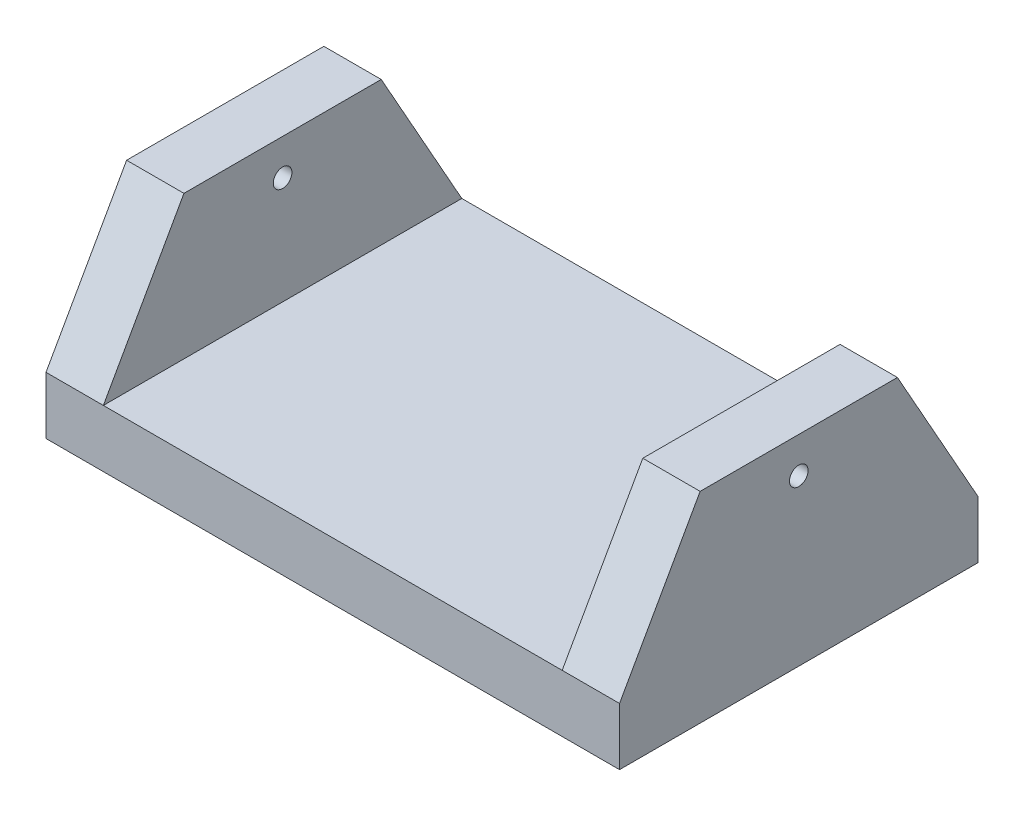
ISO-10303-21;
HEADER;
FILE_DESCRIPTION(('STEP AP214'),'2;1');
FILE_NAME('part.step','',(''),(''),'','','');
FILE_SCHEMA(('AUTOMOTIVE_DESIGN { 1 0 10303 214 1 1 1 1 }'));
ENDSEC;
DATA;
#1=APPLICATION_CONTEXT('core data for automotive mechanical design processes');
#2=APPLICATION_PROTOCOL_DEFINITION('international standard','automotive_design',2000,#1);
#3=PRODUCT_CONTEXT('',#1,'mechanical');
#4=PRODUCT('Part','Part','',(#3));
#5=PRODUCT_RELATED_PRODUCT_CATEGORY('part','',(#4));
#6=PRODUCT_DEFINITION_FORMATION('','',#4);
#7=PRODUCT_DEFINITION_CONTEXT('part definition',#1,'design');
#8=PRODUCT_DEFINITION('design','',#6,#7);
#9=PRODUCT_DEFINITION_SHAPE('','',#8);
#10=(LENGTH_UNIT() NAMED_UNIT(*) SI_UNIT(.MILLI.,.METRE.));
#11=(NAMED_UNIT(*) PLANE_ANGLE_UNIT() SI_UNIT($,.RADIAN.));
#12=(NAMED_UNIT(*) SI_UNIT($,.STERADIAN.) SOLID_ANGLE_UNIT());
#13=UNCERTAINTY_MEASURE_WITH_UNIT(LENGTH_MEASURE(1.E-05),#10,'distance_accuracy_value','');
#14=(GEOMETRIC_REPRESENTATION_CONTEXT(3) GLOBAL_UNCERTAINTY_ASSIGNED_CONTEXT((#13)) GLOBAL_UNIT_ASSIGNED_CONTEXT((#10,
#11,#12)) REPRESENTATION_CONTEXT('',''));
#15=CARTESIAN_POINT('',(0.,0.,0.));
#16=DIRECTION('',(0.,0.,1.));
#17=DIRECTION('',(1.,0.,0.));
#18=AXIS2_PLACEMENT_3D('',#15,#16,#17);
#19=CARTESIAN_POINT('',(0.,8.,0.));
#20=DIRECTION('',(0.,1.,0.));
#21=DIRECTION('',(0.,0.,1.));
#22=AXIS2_PLACEMENT_3D('',#19,#20,#21);
#23=PLANE('',#22);
#24=DIRECTION('',(-1.,0.,0.));
#25=VECTOR('',#24,1.);
#26=CARTESIAN_POINT('',(-40.,8.,-25.));
#27=LINE('',#26,#25);
#28=CARTESIAN_POINT('',(32.,8.,-25.));
#29=VERTEX_POINT('',#28);
#30=CARTESIAN_POINT('',(-32.,8.,-25.));
#31=VERTEX_POINT('',#30);
#32=EDGE_CURVE('E223',#29,#31,#27,.T.);
#33=ORIENTED_EDGE('',*,*,#32,.T.);
#34=DIRECTION('',(0.,0.,1.));
#35=VECTOR('',#34,1.);
#36=CARTESIAN_POINT('',(-32.,8.,0.));
#37=LINE('',#36,#35);
#38=CARTESIAN_POINT('',(-32.,8.,25.));
#39=VERTEX_POINT('',#38);
#40=EDGE_CURVE('E63',#31,#39,#37,.T.);
#41=ORIENTED_EDGE('',*,*,#40,.T.);
#42=DIRECTION('',(1.,0.,0.));
#43=VECTOR('',#42,1.);
#44=CARTESIAN_POINT('',(-40.,8.,25.));
#45=LINE('',#44,#43);
#46=CARTESIAN_POINT('',(32.,8.,25.));
#47=VERTEX_POINT('',#46);
#48=EDGE_CURVE('E222',#39,#47,#45,.T.);
#49=ORIENTED_EDGE('',*,*,#48,.T.);
#50=DIRECTION('',(0.,0.,1.));
#51=VECTOR('',#50,1.);
#52=CARTESIAN_POINT('',(32.,8.,0.));
#53=LINE('',#52,#51);
#54=EDGE_CURVE('E189',#29,#47,#53,.T.);
#55=ORIENTED_EDGE('',*,*,#54,.F.);
#56=EDGE_LOOP('',(#33,#41,#49,#55));
#57=FACE_BOUND('',#56,.T.);
#58=ADVANCED_FACE('F47',(#57),#23,.T.);
#59=CARTESIAN_POINT('',(40.,8.,-25.));
#60=DIRECTION('',(-1.,0.,0.));
#61=DIRECTION('',(0.,0.,1.));
#62=AXIS2_PLACEMENT_3D('',#59,#60,#61);
#63=PLANE('',#62);
#64=DIRECTION('',(0.,0.,-1.));
#65=VECTOR('',#64,1.);
#66=CARTESIAN_POINT('',(40.,0.,-25.));
#67=LINE('',#66,#65);
#68=CARTESIAN_POINT('',(40.,0.,25.));
#69=VERTEX_POINT('',#68);
#70=CARTESIAN_POINT('',(40.,0.,-25.));
#71=VERTEX_POINT('',#70);
#72=EDGE_CURVE('E210',#69,#71,#67,.T.);
#73=ORIENTED_EDGE('',*,*,#72,.T.);
#74=DIRECTION('',(0.,-1.,0.));
#75=VECTOR('',#74,1.);
#76=CARTESIAN_POINT('',(40.,8.,-25.));
#77=LINE('',#76,#75);
#78=CARTESIAN_POINT('',(40.,8.,-25.));
#79=VERTEX_POINT('',#78);
#80=EDGE_CURVE('E11',#79,#71,#77,.T.);
#81=ORIENTED_EDGE('',*,*,#80,.F.);
#82=DIRECTION('',(0.,-0.871729821083831,-0.489986855979986));
#83=VECTOR('',#82,1.);
#84=CARTESIAN_POINT('',(40.,12.5991008096868,-22.4149112585461));
#85=LINE('',#84,#83);
#86=CARTESIAN_POINT('',(40.,28.,-13.7582862458283));
#87=VERTEX_POINT('',#86);
#88=EDGE_CURVE('E197',#87,#79,#85,.T.);
#89=ORIENTED_EDGE('',*,*,#88,.F.);
#90=DIRECTION('',(0.,0.,-1.));
#91=VECTOR('',#90,1.);
#92=CARTESIAN_POINT('',(40.,28.,0.));
#93=LINE('',#92,#91);
#94=CARTESIAN_POINT('',(40.,28.,13.7582862458283));
#95=VERTEX_POINT('',#94);
#96=EDGE_CURVE('E201',#95,#87,#93,.T.);
#97=ORIENTED_EDGE('',*,*,#96,.F.);
#98=DIRECTION('',(0.,0.871729821083831,-0.489986855979986));
#99=VECTOR('',#98,1.);
#100=CARTESIAN_POINT('',(40.,12.5991008096868,22.4149112585461));
#101=LINE('',#100,#99);
#102=CARTESIAN_POINT('',(40.,8.,25.));
#103=VERTEX_POINT('',#102);
#104=EDGE_CURVE('E179',#103,#95,#101,.T.);
#105=ORIENTED_EDGE('',*,*,#104,.F.);
#106=DIRECTION('',(0.,-1.,0.));
#107=VECTOR('',#106,1.);
#108=CARTESIAN_POINT('',(40.,8.,25.));
#109=LINE('',#108,#107);
#110=EDGE_CURVE('E226',#103,#69,#109,.T.);
#111=ORIENTED_EDGE('',*,*,#110,.T.);
#112=EDGE_LOOP('',(#73,#81,#89,#97,#105,#111));
#113=FACE_BOUND('',#112,.T.);
#114=CARTESIAN_POINT('',(40.,23.,0.));
#115=DIRECTION('',(1.,0.,0.));
#116=DIRECTION('',(0.,0.,-1.));
#117=AXIS2_PLACEMENT_3D('',#114,#115,#116);
#118=CIRCLE('',#117,1.3);
#119=CARTESIAN_POINT('',(40.,23.,-1.3));
#120=VERTEX_POINT('',#119);
#121=EDGE_CURVE('E172',#120,#120,#118,.T.);
#122=ORIENTED_EDGE('',*,*,#121,.F.);
#123=EDGE_LOOP('',(#122));
#124=FACE_BOUND('',#123,.T.);
#125=ADVANCED_FACE('F49',(#113,#124),#63,.F.);
#126=CARTESIAN_POINT('',(-40.,8.,-25.));
#127=DIRECTION('',(0.,0.,1.));
#128=DIRECTION('',(1.,0.,0.));
#129=AXIS2_PLACEMENT_3D('',#126,#127,#128);
#130=PLANE('',#129);
#131=DIRECTION('',(-1.,0.,0.));
#132=VECTOR('',#131,1.);
#133=CARTESIAN_POINT('',(-40.,0.,-25.));
#134=LINE('',#133,#132);
#135=CARTESIAN_POINT('',(-40.,0.,-25.));
#136=VERTEX_POINT('',#135);
#137=EDGE_CURVE('E230',#71,#136,#134,.T.);
#138=ORIENTED_EDGE('',*,*,#137,.T.);
#139=DIRECTION('',(0.,-1.,0.));
#140=VECTOR('',#139,1.);
#141=CARTESIAN_POINT('',(-40.,8.,-25.));
#142=LINE('',#141,#140);
#143=CARTESIAN_POINT('',(-40.,8.,-25.));
#144=VERTEX_POINT('',#143);
#145=EDGE_CURVE('E56',#144,#136,#142,.T.);
#146=ORIENTED_EDGE('',*,*,#145,.F.);
#147=DIRECTION('',(-1.,0.,0.));
#148=VECTOR('',#147,1.);
#149=CARTESIAN_POINT('',(-32.,8.,-25.));
#150=LINE('',#149,#148);
#151=EDGE_CURVE('E71',#31,#144,#150,.T.);
#152=ORIENTED_EDGE('',*,*,#151,.F.);
#153=ORIENTED_EDGE('',*,*,#32,.F.);
#154=EDGE_CURVE('E218',#79,#29,#27,.T.);
#155=ORIENTED_EDGE('',*,*,#154,.F.);
#156=ORIENTED_EDGE('',*,*,#80,.T.);
#157=EDGE_LOOP('',(#138,#146,#152,#153,#155,#156));
#158=FACE_BOUND('',#157,.T.);
#159=ADVANCED_FACE('F277',(#158),#130,.F.);
#160=CARTESIAN_POINT('',(-40.,8.,-25.));
#161=DIRECTION('',(1.,0.,0.));
#162=DIRECTION('',(0.,0.,-1.));
#163=AXIS2_PLACEMENT_3D('',#160,#161,#162);
#164=PLANE('',#163);
#165=DIRECTION('',(0.,0.,1.));
#166=VECTOR('',#165,1.);
#167=CARTESIAN_POINT('',(-40.,0.,-25.));
#168=LINE('',#167,#166);
#169=CARTESIAN_POINT('',(-40.,0.,25.));
#170=VERTEX_POINT('',#169);
#171=EDGE_CURVE('E233',#136,#170,#168,.T.);
#172=ORIENTED_EDGE('',*,*,#171,.T.);
#173=DIRECTION('',(0.,-1.,0.));
#174=VECTOR('',#173,1.);
#175=CARTESIAN_POINT('',(-40.,8.,25.));
#176=LINE('',#175,#174);
#177=CARTESIAN_POINT('',(-40.,8.,25.));
#178=VERTEX_POINT('',#177);
#179=EDGE_CURVE('E242',#178,#170,#176,.T.);
#180=ORIENTED_EDGE('',*,*,#179,.F.);
#181=DIRECTION('',(0.,0.871729821083831,-0.489986855979986));
#182=VECTOR('',#181,1.);
#183=CARTESIAN_POINT('',(-40.,12.5991008096868,22.4149112585461));
#184=LINE('',#183,#182);
#185=CARTESIAN_POINT('',(-40.,28.,13.7582862458283));
#186=VERTEX_POINT('',#185);
#187=EDGE_CURVE('E165',#178,#186,#184,.T.);
#188=ORIENTED_EDGE('',*,*,#187,.T.);
#189=DIRECTION('',(0.,0.,-1.));
#190=VECTOR('',#189,1.);
#191=CARTESIAN_POINT('',(-40.,28.,0.));
#192=LINE('',#191,#190);
#193=CARTESIAN_POINT('',(-40.,28.,-13.7582862458283));
#194=VERTEX_POINT('',#193);
#195=EDGE_CURVE('E132',#186,#194,#192,.T.);
#196=ORIENTED_EDGE('',*,*,#195,.T.);
#197=DIRECTION('',(0.,-0.871729821083831,-0.489986855979986));
#198=VECTOR('',#197,1.);
#199=CARTESIAN_POINT('',(-40.,12.5991008096868,-22.4149112585461));
#200=LINE('',#199,#198);
#201=EDGE_CURVE('E161',#194,#144,#200,.T.);
#202=ORIENTED_EDGE('',*,*,#201,.T.);
#203=ORIENTED_EDGE('',*,*,#145,.T.);
#204=EDGE_LOOP('',(#172,#180,#188,#196,#202,#203));
#205=FACE_BOUND('',#204,.T.);
#206=CARTESIAN_POINT('',(-40.,23.,0.));
#207=DIRECTION('',(1.,0.,0.));
#208=DIRECTION('',(0.,0.,-1.));
#209=AXIS2_PLACEMENT_3D('',#206,#207,#208);
#210=CIRCLE('',#209,1.3);
#211=CARTESIAN_POINT('',(-40.,23.,-1.3));
#212=VERTEX_POINT('',#211);
#213=EDGE_CURVE('E157',#212,#212,#210,.T.);
#214=ORIENTED_EDGE('',*,*,#213,.T.);
#215=EDGE_LOOP('',(#214));
#216=FACE_BOUND('',#215,.T.);
#217=ADVANCED_FACE('F249',(#205,#216),#164,.F.);
#218=CARTESIAN_POINT('',(-40.,8.,25.));
#219=DIRECTION('',(0.,0.,-1.));
#220=DIRECTION('',(-1.,0.,0.));
#221=AXIS2_PLACEMENT_3D('',#218,#219,#220);
#222=PLANE('',#221);
#223=DIRECTION('',(1.,0.,0.));
#224=VECTOR('',#223,1.);
#225=CARTESIAN_POINT('',(-40.,0.,25.));
#226=LINE('',#225,#224);
#227=EDGE_CURVE('E236',#170,#69,#226,.T.);
#228=ORIENTED_EDGE('',*,*,#227,.T.);
#229=ORIENTED_EDGE('',*,*,#110,.F.);
#230=DIRECTION('',(1.,0.,0.));
#231=VECTOR('',#230,1.);
#232=CARTESIAN_POINT('',(32.,8.,25.));
#233=LINE('',#232,#231);
#234=EDGE_CURVE('E206',#47,#103,#233,.T.);
#235=ORIENTED_EDGE('',*,*,#234,.F.);
#236=ORIENTED_EDGE('',*,*,#48,.F.);
#237=EDGE_CURVE('E143',#178,#39,#45,.T.);
#238=ORIENTED_EDGE('',*,*,#237,.F.);
#239=ORIENTED_EDGE('',*,*,#179,.T.);
#240=EDGE_LOOP('',(#228,#229,#235,#236,#238,#239));
#241=FACE_BOUND('',#240,.T.);
#242=ADVANCED_FACE('F258',(#241),#222,.F.);
#243=CARTESIAN_POINT('',(0.,0.,0.));
#244=DIRECTION('',(0.,1.,0.));
#245=DIRECTION('',(0.,0.,1.));
#246=AXIS2_PLACEMENT_3D('',#243,#244,#245);
#247=PLANE('',#246);
#248=ORIENTED_EDGE('',*,*,#72,.F.);
#249=ORIENTED_EDGE('',*,*,#227,.F.);
#250=ORIENTED_EDGE('',*,*,#171,.F.);
#251=ORIENTED_EDGE('',*,*,#137,.F.);
#252=EDGE_LOOP('',(#248,#249,#250,#251));
#253=FACE_BOUND('',#252,.T.);
#254=ADVANCED_FACE('F256',(#253),#247,.F.);
#255=CARTESIAN_POINT('',(32.,12.5991008096868,-22.4149112585461));
#256=DIRECTION('',(0.,-0.489986855979986,0.871729821083831));
#257=DIRECTION('',(0.,-0.871729821083831,-0.489986855979987));
#258=AXIS2_PLACEMENT_3D('',#255,#256,#257);
#259=PLANE('',#258);
#260=ORIENTED_EDGE('',*,*,#88,.T.);
#261=ORIENTED_EDGE('',*,*,#154,.T.);
#262=DIRECTION('',(0.,-0.871729821083831,-0.489986855979986));
#263=VECTOR('',#262,1.);
#264=CARTESIAN_POINT('',(32.,12.5991008096868,-22.4149112585461));
#265=LINE('',#264,#263);
#266=CARTESIAN_POINT('',(32.,28.,-13.7582862458283));
#267=VERTEX_POINT('',#266);
#268=EDGE_CURVE('E178',#267,#29,#265,.T.);
#269=ORIENTED_EDGE('',*,*,#268,.F.);
#270=DIRECTION('',(1.,0.,0.));
#271=VECTOR('',#270,1.);
#272=CARTESIAN_POINT('',(32.,28.,-13.7582862458283));
#273=LINE('',#272,#271);
#274=EDGE_CURVE('E193',#267,#87,#273,.T.);
#275=ORIENTED_EDGE('',*,*,#274,.T.);
#276=EDGE_LOOP('',(#260,#261,#269,#275));
#277=FACE_BOUND('',#276,.T.);
#278=ADVANCED_FACE('F281',(#277),#259,.F.);
#279=CARTESIAN_POINT('',(32.,12.5991008096868,22.4149112585461));
#280=DIRECTION('',(0.,-0.489986855979986,-0.871729821083831));
#281=DIRECTION('',(0.,0.871729821083831,-0.489986855979986));
#282=AXIS2_PLACEMENT_3D('',#279,#280,#281);
#283=PLANE('',#282);
#284=ORIENTED_EDGE('',*,*,#104,.T.);
#285=DIRECTION('',(1.,0.,0.));
#286=VECTOR('',#285,1.);
#287=CARTESIAN_POINT('',(32.,28.,13.7582862458283));
#288=LINE('',#287,#286);
#289=CARTESIAN_POINT('',(32.,28.,13.7582862458283));
#290=VERTEX_POINT('',#289);
#291=EDGE_CURVE('E211',#290,#95,#288,.T.);
#292=ORIENTED_EDGE('',*,*,#291,.F.);
#293=DIRECTION('',(0.,0.871729821083831,-0.489986855979986));
#294=VECTOR('',#293,1.);
#295=CARTESIAN_POINT('',(32.,12.5991008096868,22.4149112585461));
#296=LINE('',#295,#294);
#297=EDGE_CURVE('E186',#47,#290,#296,.T.);
#298=ORIENTED_EDGE('',*,*,#297,.F.);
#299=ORIENTED_EDGE('',*,*,#234,.T.);
#300=EDGE_LOOP('',(#284,#292,#298,#299));
#301=FACE_BOUND('',#300,.T.);
#302=ADVANCED_FACE('F268',(#301),#283,.F.);
#303=CARTESIAN_POINT('',(32.,23.,0.));
#304=DIRECTION('',(1.,0.,0.));
#305=DIRECTION('',(0.,0.,-1.));
#306=AXIS2_PLACEMENT_3D('',#303,#304,#305);
#307=CYLINDRICAL_SURFACE('',#306,1.3);
#308=CARTESIAN_POINT('',(32.,23.,0.));
#309=DIRECTION('',(1.,0.,0.));
#310=DIRECTION('',(0.,0.,-1.));
#311=AXIS2_PLACEMENT_3D('',#308,#309,#310);
#312=CIRCLE('',#311,1.3);
#313=CARTESIAN_POINT('',(32.,23.,-1.3));
#314=VERTEX_POINT('',#313);
#315=EDGE_CURVE('E174',#314,#314,#312,.T.);
#316=ORIENTED_EDGE('',*,*,#315,.F.);
#317=EDGE_LOOP('',(#316));
#318=FACE_BOUND('',#317,.T.);
#319=ORIENTED_EDGE('',*,*,#121,.T.);
#320=EDGE_LOOP('',(#319));
#321=FACE_BOUND('',#320,.T.);
#322=ADVANCED_FACE('F288',(#318,#321),#307,.F.);
#323=CARTESIAN_POINT('',(32.,28.,0.));
#324=DIRECTION('',(0.,-1.,0.));
#325=DIRECTION('',(0.,0.,-1.));
#326=AXIS2_PLACEMENT_3D('',#323,#324,#325);
#327=PLANE('',#326);
#328=ORIENTED_EDGE('',*,*,#96,.T.);
#329=ORIENTED_EDGE('',*,*,#274,.F.);
#330=DIRECTION('',(0.,0.,-1.));
#331=VECTOR('',#330,1.);
#332=CARTESIAN_POINT('',(32.,28.,0.));
#333=LINE('',#332,#331);
#334=EDGE_CURVE('E183',#290,#267,#333,.T.);
#335=ORIENTED_EDGE('',*,*,#334,.F.);
#336=ORIENTED_EDGE('',*,*,#291,.T.);
#337=EDGE_LOOP('',(#328,#329,#335,#336));
#338=FACE_BOUND('',#337,.T.);
#339=ADVANCED_FACE('F272',(#338),#327,.F.);
#340=CARTESIAN_POINT('',(32.,0.,0.));
#341=DIRECTION('',(1.,0.,0.));
#342=DIRECTION('',(0.,0.,-1.));
#343=AXIS2_PLACEMENT_3D('',#340,#341,#342);
#344=PLANE('',#343);
#345=ORIENTED_EDGE('',*,*,#315,.T.);
#346=EDGE_LOOP('',(#345));
#347=FACE_BOUND('',#346,.T.);
#348=ORIENTED_EDGE('',*,*,#268,.T.);
#349=ORIENTED_EDGE('',*,*,#54,.T.);
#350=ORIENTED_EDGE('',*,*,#297,.T.);
#351=ORIENTED_EDGE('',*,*,#334,.T.);
#352=EDGE_LOOP('',(#348,#349,#350,#351));
#353=FACE_BOUND('',#352,.T.);
#354=ADVANCED_FACE('F276',(#347,#353),#344,.F.);
#355=CARTESIAN_POINT('',(-32.,12.5991008096868,-22.4149112585461));
#356=DIRECTION('',(0.,0.489986855979986,-0.871729821083831));
#357=DIRECTION('',(0.,0.871729821083831,0.489986855979987));
#358=AXIS2_PLACEMENT_3D('',#355,#356,#357);
#359=PLANE('',#358);
#360=ORIENTED_EDGE('',*,*,#201,.F.);
#361=DIRECTION('',(-1.,0.,0.));
#362=VECTOR('',#361,1.);
#363=CARTESIAN_POINT('',(-32.,28.,-13.7582862458283));
#364=LINE('',#363,#362);
#365=CARTESIAN_POINT('',(-32.,28.,-13.7582862458283));
#366=VERTEX_POINT('',#365);
#367=EDGE_CURVE('E137',#366,#194,#364,.T.);
#368=ORIENTED_EDGE('',*,*,#367,.F.);
#369=DIRECTION('',(0.,-0.871729821083831,-0.489986855979986));
#370=VECTOR('',#369,1.);
#371=CARTESIAN_POINT('',(-32.,12.5991008096868,-22.4149112585461));
#372=LINE('',#371,#370);
#373=EDGE_CURVE('E150',#366,#31,#372,.T.);
#374=ORIENTED_EDGE('',*,*,#373,.T.);
#375=ORIENTED_EDGE('',*,*,#151,.T.);
#376=EDGE_LOOP('',(#360,#368,#374,#375));
#377=FACE_BOUND('',#376,.T.);
#378=ADVANCED_FACE('F324',(#377),#359,.T.);
#379=CARTESIAN_POINT('',(-32.,28.,0.));
#380=DIRECTION('',(0.,1.,0.));
#381=DIRECTION('',(0.,0.,1.));
#382=AXIS2_PLACEMENT_3D('',#379,#380,#381);
#383=PLANE('',#382);
#384=ORIENTED_EDGE('',*,*,#195,.F.);
#385=DIRECTION('',(-1.,0.,0.));
#386=VECTOR('',#385,1.);
#387=CARTESIAN_POINT('',(-32.,28.,13.7582862458283));
#388=LINE('',#387,#386);
#389=CARTESIAN_POINT('',(-32.,28.,13.7582862458283));
#390=VERTEX_POINT('',#389);
#391=EDGE_CURVE('E126',#390,#186,#388,.T.);
#392=ORIENTED_EDGE('',*,*,#391,.F.);
#393=DIRECTION('',(0.,0.,-1.));
#394=VECTOR('',#393,1.);
#395=CARTESIAN_POINT('',(-32.,28.,0.));
#396=LINE('',#395,#394);
#397=EDGE_CURVE('E130',#390,#366,#396,.T.);
#398=ORIENTED_EDGE('',*,*,#397,.T.);
#399=ORIENTED_EDGE('',*,*,#367,.T.);
#400=EDGE_LOOP('',(#384,#392,#398,#399));
#401=FACE_BOUND('',#400,.T.);
#402=ADVANCED_FACE('F128',(#401),#383,.T.);
#403=CARTESIAN_POINT('',(-32.,12.5991008096868,22.4149112585461));
#404=DIRECTION('',(0.,0.489986855979986,0.871729821083831));
#405=DIRECTION('',(0.,-0.871729821083831,0.489986855979986));
#406=AXIS2_PLACEMENT_3D('',#403,#404,#405);
#407=PLANE('',#406);
#408=ORIENTED_EDGE('',*,*,#187,.F.);
#409=ORIENTED_EDGE('',*,*,#237,.T.);
#410=DIRECTION('',(0.,0.871729821083831,-0.489986855979986));
#411=VECTOR('',#410,1.);
#412=CARTESIAN_POINT('',(-32.,12.5991008096868,22.4149112585461));
#413=LINE('',#412,#411);
#414=EDGE_CURVE('E141',#39,#390,#413,.T.);
#415=ORIENTED_EDGE('',*,*,#414,.T.);
#416=ORIENTED_EDGE('',*,*,#391,.T.);
#417=EDGE_LOOP('',(#408,#409,#415,#416));
#418=FACE_BOUND('',#417,.T.);
#419=ADVANCED_FACE('F142',(#418),#407,.T.);
#420=CARTESIAN_POINT('',(-32.,23.,0.));
#421=DIRECTION('',(-1.,0.,0.));
#422=DIRECTION('',(0.,0.,1.));
#423=AXIS2_PLACEMENT_3D('',#420,#421,#422);
#424=CYLINDRICAL_SURFACE('',#423,1.3);
#425=CARTESIAN_POINT('',(-32.,23.,0.));
#426=DIRECTION('',(1.,0.,0.));
#427=DIRECTION('',(0.,0.,-1.));
#428=AXIS2_PLACEMENT_3D('',#425,#426,#427);
#429=CIRCLE('',#428,1.3);
#430=CARTESIAN_POINT('',(-32.,23.,-1.3));
#431=VERTEX_POINT('',#430);
#432=EDGE_CURVE('E170',#431,#431,#429,.T.);
#433=ORIENTED_EDGE('',*,*,#432,.T.);
#434=EDGE_LOOP('',(#433));
#435=FACE_BOUND('',#434,.T.);
#436=ORIENTED_EDGE('',*,*,#213,.F.);
#437=EDGE_LOOP('',(#436));
#438=FACE_BOUND('',#437,.T.);
#439=ADVANCED_FACE('F342',(#435,#438),#424,.F.);
#440=CARTESIAN_POINT('',(-32.,0.,0.));
#441=DIRECTION('',(-1.,0.,0.));
#442=DIRECTION('',(0.,0.,-1.));
#443=AXIS2_PLACEMENT_3D('',#440,#441,#442);
#444=PLANE('',#443);
#445=ORIENTED_EDGE('',*,*,#432,.F.);
#446=EDGE_LOOP('',(#445));
#447=FACE_BOUND('',#446,.T.);
#448=ORIENTED_EDGE('',*,*,#373,.F.);
#449=ORIENTED_EDGE('',*,*,#397,.F.);
#450=ORIENTED_EDGE('',*,*,#414,.F.);
#451=ORIENTED_EDGE('',*,*,#40,.F.);
#452=EDGE_LOOP('',(#448,#449,#450,#451));
#453=FACE_BOUND('',#452,.T.);
#454=ADVANCED_FACE('F148',(#447,#453),#444,.F.);
#455=CLOSED_SHELL('',(#58,#125,#159,#217,#242,#254,#278,#302,#322,#339,#354,#378,#402,#419,#439,#454));
#456=MANIFOLD_SOLID_BREP('B2',#455);
#457=ADVANCED_BREP_SHAPE_REPRESENTATION('',(#18,#456),#14);
#458=SHAPE_DEFINITION_REPRESENTATION(#9,#457);
ENDSEC;
END-ISO-10303-21;
